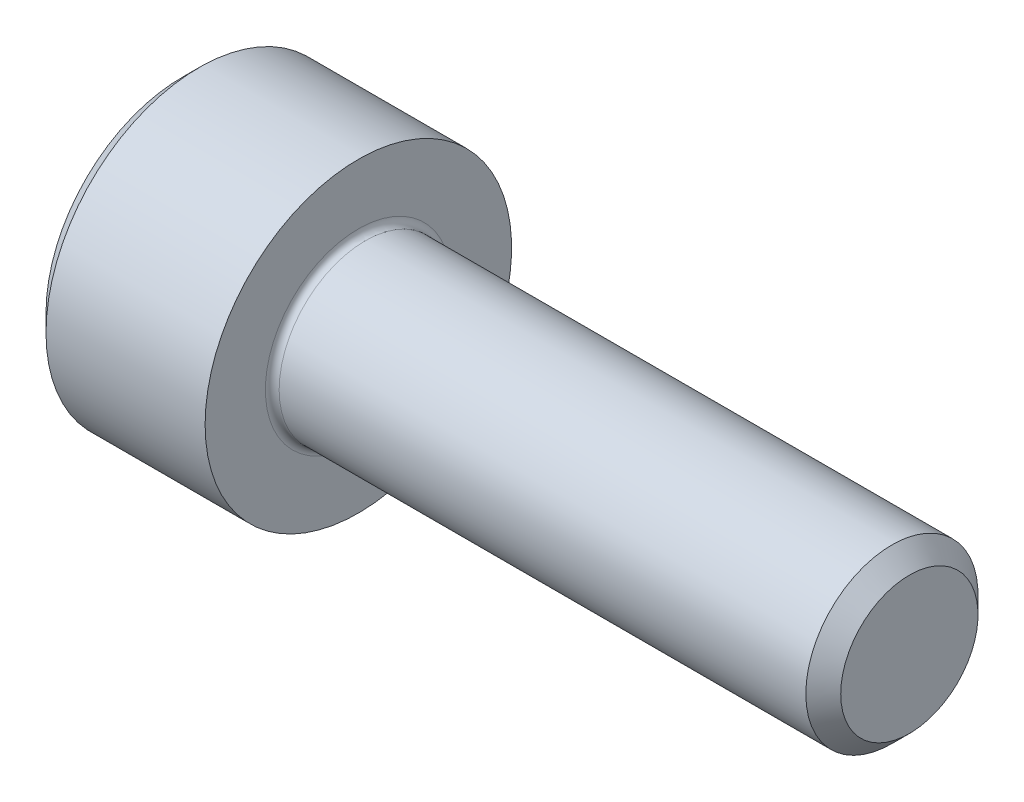
ISO-10303-21;
HEADER;
FILE_DESCRIPTION(('STEP AP214'),'2;1');
FILE_NAME('part.step','',(''),(''),'','','');
FILE_SCHEMA(('AUTOMOTIVE_DESIGN { 1 0 10303 214 1 1 1 1 }'));
ENDSEC;
DATA;
#1=APPLICATION_CONTEXT('core data for automotive mechanical design processes');
#2=APPLICATION_PROTOCOL_DEFINITION('international standard','automotive_design',2000,#1);
#3=PRODUCT_CONTEXT('',#1,'mechanical');
#4=PRODUCT('Part','Part','',(#3));
#5=PRODUCT_RELATED_PRODUCT_CATEGORY('part','',(#4));
#6=PRODUCT_DEFINITION_FORMATION('','',#4);
#7=PRODUCT_DEFINITION_CONTEXT('part definition',#1,'design');
#8=PRODUCT_DEFINITION('design','',#6,#7);
#9=PRODUCT_DEFINITION_SHAPE('','',#8);
#10=(LENGTH_UNIT() NAMED_UNIT(*) SI_UNIT(.MILLI.,.METRE.));
#11=(NAMED_UNIT(*) PLANE_ANGLE_UNIT() SI_UNIT($,.RADIAN.));
#12=(NAMED_UNIT(*) SI_UNIT($,.STERADIAN.) SOLID_ANGLE_UNIT());
#13=UNCERTAINTY_MEASURE_WITH_UNIT(LENGTH_MEASURE(1.E-05),#10,'distance_accuracy_value','');
#14=(GEOMETRIC_REPRESENTATION_CONTEXT(3) GLOBAL_UNCERTAINTY_ASSIGNED_CONTEXT((#13)) GLOBAL_UNIT_ASSIGNED_CONTEXT((#10,
#11,#12)) REPRESENTATION_CONTEXT('',''));
#15=CARTESIAN_POINT('',(0.,0.,0.));
#16=DIRECTION('',(0.,0.,1.));
#17=DIRECTION('',(1.,0.,0.));
#18=AXIS2_PLACEMENT_3D('',#15,#16,#17);
#19=CARTESIAN_POINT('',(0.,0.,0.));
#20=DIRECTION('',(-1.,0.,0.));
#21=DIRECTION('',(0.,0.,1.));
#22=AXIS2_PLACEMENT_3D('',#19,#20,#21);
#23=PLANE('',#22);
#24=DIRECTION('',(0.,-0.5,0.866025403784438));
#25=VECTOR('',#24,1.);
#26=CARTESIAN_POINT('',(0.,1.18068130049278,0.));
#27=LINE('',#26,#25);
#28=CARTESIAN_POINT('',(0.,1.18068130049278,0.));
#29=VERTEX_POINT('',#28);
#30=CARTESIAN_POINT('',(0.,0.59034065024639,1.0225));
#31=VERTEX_POINT('',#30);
#32=EDGE_CURVE('E390',#29,#31,#27,.T.);
#33=ORIENTED_EDGE('',*,*,#32,.T.);
#34=DIRECTION('',(0.,1.,0.));
#35=VECTOR('',#34,1.);
#36=CARTESIAN_POINT('',(0.,-0.590340650246395,1.0225));
#37=LINE('',#36,#35);
#38=CARTESIAN_POINT('',(0.,-0.590340650246395,1.0225));
#39=VERTEX_POINT('',#38);
#40=EDGE_CURVE('E132',#39,#31,#37,.T.);
#41=ORIENTED_EDGE('',*,*,#40,.F.);
#42=DIRECTION('',(0.,-0.500000000000001,-0.866025403784438));
#43=VECTOR('',#42,1.);
#44=CARTESIAN_POINT('',(0.,-0.590340650246395,1.0225));
#45=LINE('',#44,#43);
#46=CARTESIAN_POINT('',(0.,-1.18068130049279,0.));
#47=VERTEX_POINT('',#46);
#48=EDGE_CURVE('E393',#39,#47,#45,.T.);
#49=ORIENTED_EDGE('',*,*,#48,.T.);
#50=DIRECTION('',(0.,0.5,-0.866025403784439));
#51=VECTOR('',#50,1.);
#52=CARTESIAN_POINT('',(0.,-1.18068130049279,0.));
#53=LINE('',#52,#51);
#54=CARTESIAN_POINT('',(0.,-0.590340650246397,-1.0225));
#55=VERTEX_POINT('',#54);
#56=EDGE_CURVE('E396',#47,#55,#53,.T.);
#57=ORIENTED_EDGE('',*,*,#56,.T.);
#58=DIRECTION('',(0.,-1.,0.));
#59=VECTOR('',#58,1.);
#60=CARTESIAN_POINT('',(0.,0.590340650246389,-1.0225));
#61=LINE('',#60,#59);
#62=CARTESIAN_POINT('',(0.,0.590340650246389,-1.0225));
#63=VERTEX_POINT('',#62);
#64=EDGE_CURVE('E399',#63,#55,#61,.T.);
#65=ORIENTED_EDGE('',*,*,#64,.F.);
#66=DIRECTION('',(0.,-0.500000000000001,-0.866025403784438));
#67=VECTOR('',#66,1.);
#68=CARTESIAN_POINT('',(0.,1.18068130049278,0.));
#69=LINE('',#68,#67);
#70=EDGE_CURVE('E127',#29,#63,#69,.T.);
#71=ORIENTED_EDGE('',*,*,#70,.F.);
#72=EDGE_LOOP('',(#33,#41,#49,#57,#65,#71));
#73=FACE_BOUND('',#72,.T.);
#74=CARTESIAN_POINT('',(0.,0.,0.));
#75=DIRECTION('',(-1.,0.,0.));
#76=DIRECTION('',(0.,0.,1.));
#77=AXIS2_PLACEMENT_3D('',#74,#75,#76);
#78=CIRCLE('',#77,1.975);
#79=CARTESIAN_POINT('',(0.,0.,1.975));
#80=VERTEX_POINT('',#79);
#81=EDGE_CURVE('E143',#80,#80,#78,.T.);
#82=ORIENTED_EDGE('',*,*,#81,.T.);
#83=EDGE_LOOP('',(#82));
#84=FACE_BOUND('',#83,.T.);
#85=ADVANCED_FACE('F36',(#73,#84),#23,.T.);
#86=CARTESIAN_POINT('',(10.56,0.9965,0.));
#87=DIRECTION('',(1.,0.,0.));
#88=DIRECTION('',(0.,0.,-1.));
#89=AXIS2_PLACEMENT_3D('',#86,#87,#88);
#90=PLANE('',#89);
#91=CARTESIAN_POINT('',(10.56,0.,0.));
#92=DIRECTION('',(-1.,0.,0.));
#93=DIRECTION('',(0.,0.,1.));
#94=AXIS2_PLACEMENT_3D('',#91,#92,#93);
#95=CIRCLE('',#94,0.9965);
#96=CARTESIAN_POINT('',(10.56,0.,0.9965));
#97=VERTEX_POINT('',#96);
#98=EDGE_CURVE('E156',#97,#97,#95,.T.);
#99=ORIENTED_EDGE('',*,*,#98,.F.);
#100=EDGE_LOOP('',(#99));
#101=FACE_BOUND('',#100,.T.);
#102=ADVANCED_FACE('F177',(#101),#90,.T.);
#103=CARTESIAN_POINT('',(10.56,0.,0.));
#104=DIRECTION('',(-1.,0.,0.));
#105=DIRECTION('',(0.,0.,1.));
#106=AXIS2_PLACEMENT_3D('',#103,#104,#105);
#107=CONICAL_SURFACE('',#106,0.9965,0.78539816339725);
#108=CARTESIAN_POINT('',(10.3065,0.,0.));
#109=DIRECTION('',(-1.,0.,0.));
#110=DIRECTION('',(0.,0.,1.));
#111=AXIS2_PLACEMENT_3D('',#108,#109,#110);
#112=CIRCLE('',#111,1.24999999999994);
#113=CARTESIAN_POINT('',(10.3065,0.,1.24999999999994));
#114=VERTEX_POINT('',#113);
#115=EDGE_CURVE('E153',#114,#114,#112,.T.);
#116=ORIENTED_EDGE('',*,*,#115,.F.);
#117=EDGE_LOOP('',(#116));
#118=FACE_BOUND('',#117,.T.);
#119=ORIENTED_EDGE('',*,*,#98,.T.);
#120=EDGE_LOOP('',(#119));
#121=FACE_BOUND('',#120,.T.);
#122=ADVANCED_FACE('F183',(#118,#121),#107,.T.);
#123=CARTESIAN_POINT('',(-31.75,0.,0.));
#124=DIRECTION('',(-1.,0.,0.));
#125=DIRECTION('',(0.,0.,1.));
#126=AXIS2_PLACEMENT_3D('',#123,#124,#125);
#127=CYLINDRICAL_SURFACE('',#126,1.24999999999994);
#128=CARTESIAN_POINT('',(2.66,0.,0.));
#129=DIRECTION('',(1.,0.,0.));
#130=DIRECTION('',(0.,0.,-1.));
#131=AXIS2_PLACEMENT_3D('',#128,#129,#130);
#132=CIRCLE('',#131,1.24999999999994);
#133=CARTESIAN_POINT('',(2.66,0.,-1.24999999999994));
#134=VERTEX_POINT('',#133);
#135=EDGE_CURVE('E11',#134,#134,#132,.T.);
#136=ORIENTED_EDGE('',*,*,#135,.T.);
#137=EDGE_LOOP('',(#136));
#138=FACE_BOUND('',#137,.T.);
#139=ORIENTED_EDGE('',*,*,#115,.T.);
#140=EDGE_LOOP('',(#139));
#141=FACE_BOUND('',#140,.T.);
#142=ADVANCED_FACE('F194',(#138,#141),#127,.T.);
#143=CARTESIAN_POINT('',(2.56,2.225,0.));
#144=DIRECTION('',(1.,0.,0.));
#145=DIRECTION('',(0.,0.,-1.));
#146=AXIS2_PLACEMENT_3D('',#143,#144,#145);
#147=PLANE('',#146);
#148=CARTESIAN_POINT('',(2.56,0.,0.));
#149=DIRECTION('',(1.,0.,0.));
#150=DIRECTION('',(0.,0.,-1.));
#151=AXIS2_PLACEMENT_3D('',#148,#149,#150);
#152=CIRCLE('',#151,1.34999999999995);
#153=CARTESIAN_POINT('',(2.56,0.,-1.34999999999995));
#154=VERTEX_POINT('',#153);
#155=EDGE_CURVE('E44',#154,#154,#152,.F.);
#156=ORIENTED_EDGE('',*,*,#155,.T.);
#157=EDGE_LOOP('',(#156));
#158=FACE_BOUND('',#157,.T.);
#159=CARTESIAN_POINT('',(2.56,0.,0.));
#160=DIRECTION('',(-1.,0.,0.));
#161=DIRECTION('',(0.,0.,1.));
#162=AXIS2_PLACEMENT_3D('',#159,#160,#161);
#163=CIRCLE('',#162,2.225);
#164=CARTESIAN_POINT('',(2.56,0.,2.225));
#165=VERTEX_POINT('',#164);
#166=EDGE_CURVE('E150',#165,#165,#163,.T.);
#167=ORIENTED_EDGE('',*,*,#166,.F.);
#168=EDGE_LOOP('',(#167));
#169=FACE_BOUND('',#168,.T.);
#170=ADVANCED_FACE('F161',(#158,#169),#147,.T.);
#171=CARTESIAN_POINT('',(-31.75,0.,0.));
#172=DIRECTION('',(-1.,0.,0.));
#173=DIRECTION('',(0.,0.,1.));
#174=AXIS2_PLACEMENT_3D('',#171,#172,#173);
#175=CYLINDRICAL_SURFACE('',#174,2.225);
#176=ORIENTED_EDGE('',*,*,#166,.T.);
#177=EDGE_LOOP('',(#176));
#178=FACE_BOUND('',#177,.T.);
#179=CARTESIAN_POINT('',(0.25,0.,0.));
#180=DIRECTION('',(-1.,0.,0.));
#181=DIRECTION('',(0.,0.,1.));
#182=AXIS2_PLACEMENT_3D('',#179,#180,#181);
#183=CIRCLE('',#182,2.225);
#184=CARTESIAN_POINT('',(0.25,0.,2.225));
#185=VERTEX_POINT('',#184);
#186=EDGE_CURVE('E147',#185,#185,#183,.T.);
#187=ORIENTED_EDGE('',*,*,#186,.F.);
#188=EDGE_LOOP('',(#187));
#189=FACE_BOUND('',#188,.T.);
#190=ADVANCED_FACE('F172',(#178,#189),#175,.T.);
#191=CARTESIAN_POINT('',(0.,0.,0.));
#192=DIRECTION('',(1.,0.,0.));
#193=DIRECTION('',(0.,0.,-1.));
#194=AXIS2_PLACEMENT_3D('',#191,#192,#193);
#195=CONICAL_SURFACE('',#194,1.975,0.78539816339745);
#196=ORIENTED_EDGE('',*,*,#186,.T.);
#197=EDGE_LOOP('',(#196));
#198=FACE_BOUND('',#197,.T.);
#199=ORIENTED_EDGE('',*,*,#81,.F.);
#200=EDGE_LOOP('',(#199));
#201=FACE_BOUND('',#200,.T.);
#202=ADVANCED_FACE('F165',(#198,#201),#195,.T.);
#203=CARTESIAN_POINT('',(2.66,0.,0.));
#204=DIRECTION('',(1.,0.,0.));
#205=DIRECTION('',(0.,0.,-1.));
#206=AXIS2_PLACEMENT_3D('',#203,#204,#205);
#207=TOROIDAL_SURFACE('',#206,1.34999999999995,0.1);
#208=ORIENTED_EDGE('',*,*,#135,.F.);
#209=EDGE_LOOP('',(#208));
#210=FACE_BOUND('',#209,.T.);
#211=ORIENTED_EDGE('',*,*,#155,.F.);
#212=EDGE_LOOP('',(#211));
#213=FACE_BOUND('',#212,.T.);
#214=ADVANCED_FACE('F38',(#210,#213),#207,.F.);
#215=CARTESIAN_POINT('',(1.1,1.18068130049278,0.));
#216=DIRECTION('',(0.,-0.866025403784439,-0.5));
#217=DIRECTION('',(0.,0.5,-0.866025403784438));
#218=AXIS2_PLACEMENT_3D('',#215,#216,#217);
#219=PLANE('',#218);
#220=ORIENTED_EDGE('',*,*,#32,.F.);
#221=DIRECTION('',(-1.,0.,0.));
#222=VECTOR('',#221,1.);
#223=CARTESIAN_POINT('',(1.1,1.18068130049278,0.));
#224=LINE('',#223,#222);
#225=CARTESIAN_POINT('',(1.1,1.18068130049278,0.));
#226=VERTEX_POINT('',#225);
#227=EDGE_CURVE('E380',#226,#29,#224,.T.);
#228=ORIENTED_EDGE('',*,*,#227,.F.);
#229=DIRECTION('',(0.,-0.5,0.866025403784438));
#230=VECTOR('',#229,1.);
#231=CARTESIAN_POINT('',(1.1,1.18068130049278,0.));
#232=LINE('',#231,#230);
#233=CARTESIAN_POINT('',(1.1,0.885510975369585,0.511249999999998));
#234=VERTEX_POINT('',#233);
#235=EDGE_CURVE('E119',#226,#234,#232,.T.);
#236=ORIENTED_EDGE('',*,*,#235,.T.);
#237=CARTESIAN_POINT('',(1.1,0.59034065024639,1.0225));
#238=VERTEX_POINT('',#237);
#239=EDGE_CURVE('E110',#234,#238,#232,.T.);
#240=ORIENTED_EDGE('',*,*,#239,.T.);
#241=DIRECTION('',(-1.,0.,0.));
#242=VECTOR('',#241,1.);
#243=CARTESIAN_POINT('',(1.1,0.59034065024639,1.0225));
#244=LINE('',#243,#242);
#245=EDGE_CURVE('E124',#238,#31,#244,.T.);
#246=ORIENTED_EDGE('',*,*,#245,.T.);
#247=EDGE_LOOP('',(#220,#228,#236,#240,#246));
#248=FACE_BOUND('',#247,.T.);
#249=ADVANCED_FACE('F123',(#248),#219,.T.);
#250=CARTESIAN_POINT('',(1.1,-0.590340650246395,1.0225));
#251=DIRECTION('',(0.,0.,1.));
#252=DIRECTION('',(0.,-1.,0.));
#253=AXIS2_PLACEMENT_3D('',#250,#251,#252);
#254=PLANE('',#253);
#255=ORIENTED_EDGE('',*,*,#40,.T.);
#256=ORIENTED_EDGE('',*,*,#245,.F.);
#257=DIRECTION('',(0.,1.,0.));
#258=VECTOR('',#257,1.);
#259=CARTESIAN_POINT('',(1.1,-0.590340650246395,1.0225));
#260=LINE('',#259,#258);
#261=CARTESIAN_POINT('',(1.1,0.,1.0225));
#262=VERTEX_POINT('',#261);
#263=EDGE_CURVE('E107',#262,#238,#260,.T.);
#264=ORIENTED_EDGE('',*,*,#263,.F.);
#265=CARTESIAN_POINT('',(1.1,-0.590340650246395,1.0225));
#266=VERTEX_POINT('',#265);
#267=EDGE_CURVE('E118',#266,#262,#260,.T.);
#268=ORIENTED_EDGE('',*,*,#267,.F.);
#269=DIRECTION('',(-1.,0.,0.));
#270=VECTOR('',#269,1.);
#271=CARTESIAN_POINT('',(1.1,-0.590340650246395,1.0225));
#272=LINE('',#271,#270);
#273=EDGE_CURVE('E134',#266,#39,#272,.T.);
#274=ORIENTED_EDGE('',*,*,#273,.T.);
#275=EDGE_LOOP('',(#255,#256,#264,#268,#274));
#276=FACE_BOUND('',#275,.T.);
#277=ADVANCED_FACE('F129',(#276),#254,.F.);
#278=CARTESIAN_POINT('',(1.1,-0.590340650246395,1.0225));
#279=DIRECTION('',(0.,0.866025403784438,-0.500000000000001));
#280=DIRECTION('',(0.,0.500000000000001,0.866025403784438));
#281=AXIS2_PLACEMENT_3D('',#278,#279,#280);
#282=PLANE('',#281);
#283=ORIENTED_EDGE('',*,*,#48,.F.);
#284=ORIENTED_EDGE('',*,*,#273,.F.);
#285=DIRECTION('',(0.,-0.500000000000001,-0.866025403784438));
#286=VECTOR('',#285,1.);
#287=CARTESIAN_POINT('',(1.1,-0.590340650246395,1.0225));
#288=LINE('',#287,#286);
#289=CARTESIAN_POINT('',(1.1,-0.88551097536959,0.511250000000002));
#290=VERTEX_POINT('',#289);
#291=EDGE_CURVE('E419',#266,#290,#288,.T.);
#292=ORIENTED_EDGE('',*,*,#291,.T.);
#293=CARTESIAN_POINT('',(1.1,-1.18068130049279,0.));
#294=VERTEX_POINT('',#293);
#295=EDGE_CURVE('E408',#290,#294,#288,.T.);
#296=ORIENTED_EDGE('',*,*,#295,.T.);
#297=DIRECTION('',(-1.,0.,0.));
#298=VECTOR('',#297,1.);
#299=CARTESIAN_POINT('',(1.1,-1.18068130049279,0.));
#300=LINE('',#299,#298);
#301=EDGE_CURVE('E139',#294,#47,#300,.T.);
#302=ORIENTED_EDGE('',*,*,#301,.T.);
#303=EDGE_LOOP('',(#283,#284,#292,#296,#302));
#304=FACE_BOUND('',#303,.T.);
#305=ADVANCED_FACE('F271',(#304),#282,.T.);
#306=CARTESIAN_POINT('',(1.1,-1.18068130049279,0.));
#307=DIRECTION('',(0.,0.866025403784439,0.5));
#308=DIRECTION('',(0.,-0.5,0.866025403784439));
#309=AXIS2_PLACEMENT_3D('',#306,#307,#308);
#310=PLANE('',#309);
#311=ORIENTED_EDGE('',*,*,#56,.F.);
#312=ORIENTED_EDGE('',*,*,#301,.F.);
#313=DIRECTION('',(0.,0.5,-0.866025403784439));
#314=VECTOR('',#313,1.);
#315=CARTESIAN_POINT('',(1.1,-1.18068130049279,0.));
#316=LINE('',#315,#314);
#317=CARTESIAN_POINT('',(1.1,-0.885510975369592,-0.511250000000002));
#318=VERTEX_POINT('',#317);
#319=EDGE_CURVE('E386',#294,#318,#316,.T.);
#320=ORIENTED_EDGE('',*,*,#319,.T.);
#321=CARTESIAN_POINT('',(1.1,-0.590340650246397,-1.0225));
#322=VERTEX_POINT('',#321);
#323=EDGE_CURVE('E418',#318,#322,#316,.T.);
#324=ORIENTED_EDGE('',*,*,#323,.T.);
#325=DIRECTION('',(-1.,0.,0.));
#326=VECTOR('',#325,1.);
#327=CARTESIAN_POINT('',(1.1,-0.590340650246397,-1.0225));
#328=LINE('',#327,#326);
#329=EDGE_CURVE('E379',#322,#55,#328,.T.);
#330=ORIENTED_EDGE('',*,*,#329,.T.);
#331=EDGE_LOOP('',(#311,#312,#320,#324,#330));
#332=FACE_BOUND('',#331,.T.);
#333=ADVANCED_FACE('F279',(#332),#310,.T.);
#334=CARTESIAN_POINT('',(1.1,0.590340650246389,-1.0225));
#335=DIRECTION('',(0.,0.,-1.));
#336=DIRECTION('',(0.,1.,0.));
#337=AXIS2_PLACEMENT_3D('',#334,#335,#336);
#338=PLANE('',#337);
#339=ORIENTED_EDGE('',*,*,#64,.T.);
#340=ORIENTED_EDGE('',*,*,#329,.F.);
#341=DIRECTION('',(0.,-1.,0.));
#342=VECTOR('',#341,1.);
#343=CARTESIAN_POINT('',(1.1,0.590340650246389,-1.0225));
#344=LINE('',#343,#342);
#345=CARTESIAN_POINT('',(1.1,0.,-1.0225));
#346=VERTEX_POINT('',#345);
#347=EDGE_CURVE('E383',#346,#322,#344,.T.);
#348=ORIENTED_EDGE('',*,*,#347,.F.);
#349=CARTESIAN_POINT('',(1.1,0.590340650246389,-1.0225));
#350=VERTEX_POINT('',#349);
#351=EDGE_CURVE('E51',#350,#346,#344,.T.);
#352=ORIENTED_EDGE('',*,*,#351,.F.);
#353=DIRECTION('',(-1.,0.,0.));
#354=VECTOR('',#353,1.);
#355=CARTESIAN_POINT('',(1.1,0.590340650246389,-1.0225));
#356=LINE('',#355,#354);
#357=EDGE_CURVE('E376',#350,#63,#356,.T.);
#358=ORIENTED_EDGE('',*,*,#357,.T.);
#359=EDGE_LOOP('',(#339,#340,#348,#352,#358));
#360=FACE_BOUND('',#359,.T.);
#361=ADVANCED_FACE('F288',(#360),#338,.F.);
#362=CARTESIAN_POINT('',(1.1,1.18068130049278,0.));
#363=DIRECTION('',(0.,0.866025403784438,-0.500000000000001));
#364=DIRECTION('',(0.,0.500000000000001,0.866025403784438));
#365=AXIS2_PLACEMENT_3D('',#362,#363,#364);
#366=PLANE('',#365);
#367=ORIENTED_EDGE('',*,*,#70,.T.);
#368=ORIENTED_EDGE('',*,*,#357,.F.);
#369=DIRECTION('',(0.,-0.500000000000001,-0.866025403784438));
#370=VECTOR('',#369,1.);
#371=CARTESIAN_POINT('',(1.1,1.18068130049278,0.));
#372=LINE('',#371,#370);
#373=CARTESIAN_POINT('',(1.1,0.885510975369587,-0.511250000000001));
#374=VERTEX_POINT('',#373);
#375=EDGE_CURVE('E366',#374,#350,#372,.T.);
#376=ORIENTED_EDGE('',*,*,#375,.F.);
#377=EDGE_CURVE('E372',#226,#374,#372,.T.);
#378=ORIENTED_EDGE('',*,*,#377,.F.);
#379=ORIENTED_EDGE('',*,*,#227,.T.);
#380=EDGE_LOOP('',(#367,#368,#376,#378,#379));
#381=FACE_BOUND('',#380,.T.);
#382=ADVANCED_FACE('F297',(#381),#366,.F.);
#383=CARTESIAN_POINT('',(1.1,1.18068130049278,0.));
#384=DIRECTION('',(1.,0.,0.));
#385=DIRECTION('',(0.,0.,-1.));
#386=AXIS2_PLACEMENT_3D('',#383,#384,#385);
#387=PLANE('',#386);
#388=ORIENTED_EDGE('',*,*,#347,.T.);
#389=ORIENTED_EDGE('',*,*,#323,.F.);
#390=CARTESIAN_POINT('',(1.1,0.,0.));
#391=DIRECTION('',(-1.,0.,0.));
#392=DIRECTION('',(0.,0.,1.));
#393=AXIS2_PLACEMENT_3D('',#390,#391,#392);
#394=CIRCLE('',#393,1.0225);
#395=EDGE_CURVE('E414',#346,#318,#394,.T.);
#396=ORIENTED_EDGE('',*,*,#395,.F.);
#397=EDGE_LOOP('',(#388,#389,#396));
#398=FACE_BOUND('',#397,.T.);
#399=ADVANCED_FACE('F306',(#398),#387,.F.);
#400=ORIENTED_EDGE('',*,*,#319,.F.);
#401=ORIENTED_EDGE('',*,*,#295,.F.);
#402=EDGE_CURVE('E137',#318,#290,#394,.T.);
#403=ORIENTED_EDGE('',*,*,#402,.F.);
#404=EDGE_LOOP('',(#400,#401,#403));
#405=FACE_BOUND('',#404,.T.);
#406=ADVANCED_FACE('F315',(#405),#387,.F.);
#407=ORIENTED_EDGE('',*,*,#291,.F.);
#408=ORIENTED_EDGE('',*,*,#267,.T.);
#409=EDGE_CURVE('E133',#290,#262,#394,.T.);
#410=ORIENTED_EDGE('',*,*,#409,.F.);
#411=EDGE_LOOP('',(#407,#408,#410));
#412=FACE_BOUND('',#411,.T.);
#413=ADVANCED_FACE('F324',(#412),#387,.F.);
#414=ORIENTED_EDGE('',*,*,#263,.T.);
#415=ORIENTED_EDGE('',*,*,#239,.F.);
#416=EDGE_CURVE('E113',#262,#234,#394,.T.);
#417=ORIENTED_EDGE('',*,*,#416,.F.);
#418=EDGE_LOOP('',(#414,#415,#417));
#419=FACE_BOUND('',#418,.T.);
#420=ADVANCED_FACE('F109',(#419),#387,.F.);
#421=ORIENTED_EDGE('',*,*,#235,.F.);
#422=ORIENTED_EDGE('',*,*,#377,.T.);
#423=EDGE_CURVE('E144',#234,#374,#394,.T.);
#424=ORIENTED_EDGE('',*,*,#423,.F.);
#425=EDGE_LOOP('',(#421,#422,#424));
#426=FACE_BOUND('',#425,.T.);
#427=ADVANCED_FACE('F339',(#426),#387,.F.);
#428=ORIENTED_EDGE('',*,*,#375,.T.);
#429=ORIENTED_EDGE('',*,*,#351,.T.);
#430=EDGE_CURVE('E369',#374,#346,#394,.T.);
#431=ORIENTED_EDGE('',*,*,#430,.F.);
#432=EDGE_LOOP('',(#428,#429,#431));
#433=FACE_BOUND('',#432,.T.);
#434=ADVANCED_FACE('F254',(#433),#387,.F.);
#435=CARTESIAN_POINT('',(1.1,0.,0.));
#436=DIRECTION('',(-1.,0.,0.));
#437=DIRECTION('',(0.,0.,1.));
#438=AXIS2_PLACEMENT_3D('',#435,#436,#437);
#439=CONICAL_SURFACE('',#438,1.0225,1.04719755119659);
#440=CARTESIAN_POINT('',(1.6903406502464,0.,0.));
#441=VERTEX_POINT('',#440);
#442=VERTEX_LOOP('',#441);
#443=FACE_BOUND('',#442,.T.);
#444=ORIENTED_EDGE('',*,*,#416,.T.);
#445=ORIENTED_EDGE('',*,*,#423,.T.);
#446=ORIENTED_EDGE('',*,*,#430,.T.);
#447=ORIENTED_EDGE('',*,*,#395,.T.);
#448=ORIENTED_EDGE('',*,*,#402,.T.);
#449=ORIENTED_EDGE('',*,*,#409,.T.);
#450=EDGE_LOOP('',(#444,#445,#446,#447,#448,#449));
#451=FACE_BOUND('',#450,.T.);
#452=ADVANCED_FACE('F187',(#443,#451),#439,.F.);
#453=CLOSED_SHELL('',(#85,#102,#122,#142,#170,#190,#202,#214,#249,#277,#305,#333,#361,#382,#399,
#406,#413,#420,#427,#434,#452));
#454=MANIFOLD_SOLID_BREP('B2',#453);
#455=ADVANCED_BREP_SHAPE_REPRESENTATION('',(#18,#454),#14);
#456=SHAPE_DEFINITION_REPRESENTATION(#9,#455);
ENDSEC;
END-ISO-10303-21;
